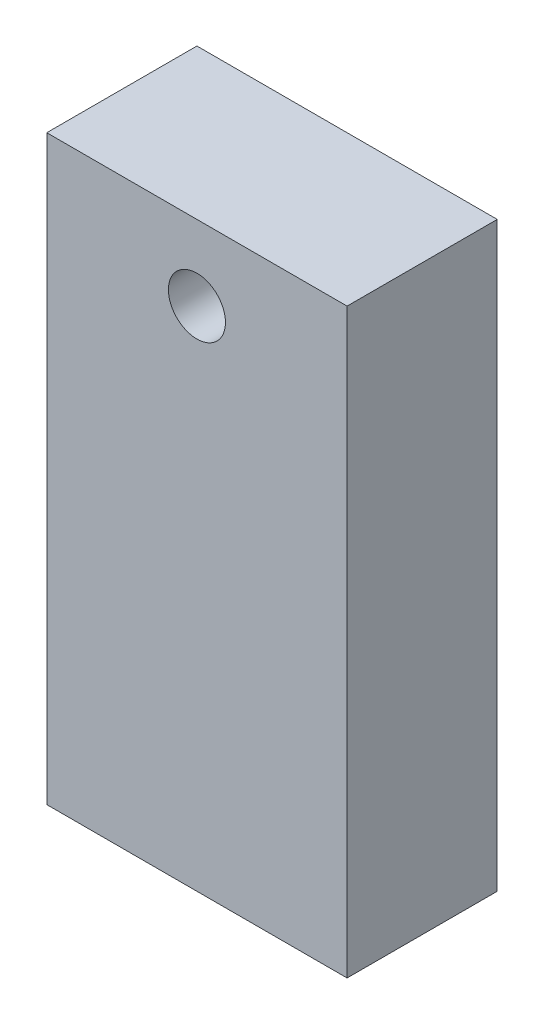
ISO-10303-21;
HEADER;
FILE_DESCRIPTION(('STEP AP214'),'2;1');
FILE_NAME('part.step','',(''),(''),'','','');
FILE_SCHEMA(('AUTOMOTIVE_DESIGN { 1 0 10303 214 1 1 1 1 }'));
ENDSEC;
DATA;
#1=APPLICATION_CONTEXT('core data for automotive mechanical design processes');
#2=APPLICATION_PROTOCOL_DEFINITION('international standard','automotive_design',2000,#1);
#3=PRODUCT_CONTEXT('',#1,'mechanical');
#4=PRODUCT('Part','Part','',(#3));
#5=PRODUCT_RELATED_PRODUCT_CATEGORY('part','',(#4));
#6=PRODUCT_DEFINITION_FORMATION('','',#4);
#7=PRODUCT_DEFINITION_CONTEXT('part definition',#1,'design');
#8=PRODUCT_DEFINITION('design','',#6,#7);
#9=PRODUCT_DEFINITION_SHAPE('','',#8);
#10=(LENGTH_UNIT() NAMED_UNIT(*) SI_UNIT(.MILLI.,.METRE.));
#11=(NAMED_UNIT(*) PLANE_ANGLE_UNIT() SI_UNIT($,.RADIAN.));
#12=(NAMED_UNIT(*) SI_UNIT($,.STERADIAN.) SOLID_ANGLE_UNIT());
#13=UNCERTAINTY_MEASURE_WITH_UNIT(LENGTH_MEASURE(1.E-05),#10,'distance_accuracy_value','');
#14=(GEOMETRIC_REPRESENTATION_CONTEXT(3) GLOBAL_UNCERTAINTY_ASSIGNED_CONTEXT((#13)) GLOBAL_UNIT_ASSIGNED_CONTEXT((#10,
#11,#12)) REPRESENTATION_CONTEXT('',''));
#15=CARTESIAN_POINT('',(0.,0.,0.));
#16=DIRECTION('',(0.,0.,1.));
#17=DIRECTION('',(1.,0.,0.));
#18=AXIS2_PLACEMENT_3D('',#15,#16,#17);
#19=CARTESIAN_POINT('',(0.,98.425,0.));
#20=DIRECTION('',(1.,0.,0.));
#21=DIRECTION('',(0.,0.,-1.));
#22=AXIS2_PLACEMENT_3D('',#19,#20,#21);
#23=PLANE('',#22);
#24=DIRECTION('',(0.,0.,1.));
#25=VECTOR('',#24,1.);
#26=CARTESIAN_POINT('',(0.,0.,0.));
#27=LINE('',#26,#25);
#28=CARTESIAN_POINT('',(0.,0.,-25.4));
#29=VERTEX_POINT('',#28);
#30=CARTESIAN_POINT('',(0.,0.,0.));
#31=VERTEX_POINT('',#30);
#32=EDGE_CURVE('E96',#29,#31,#27,.T.);
#33=ORIENTED_EDGE('',*,*,#32,.T.);
#34=DIRECTION('',(0.,-1.,0.));
#35=VECTOR('',#34,1.);
#36=CARTESIAN_POINT('',(0.,98.425,0.));
#37=LINE('',#36,#35);
#38=CARTESIAN_POINT('',(0.,98.425,0.));
#39=VERTEX_POINT('',#38);
#40=EDGE_CURVE('E11',#39,#31,#37,.T.);
#41=ORIENTED_EDGE('',*,*,#40,.F.);
#42=DIRECTION('',(0.,0.,1.));
#43=VECTOR('',#42,1.);
#44=CARTESIAN_POINT('',(0.,98.425,0.));
#45=LINE('',#44,#43);
#46=CARTESIAN_POINT('',(0.,98.425,-25.4));
#47=VERTEX_POINT('',#46);
#48=EDGE_CURVE('E84',#47,#39,#45,.T.);
#49=ORIENTED_EDGE('',*,*,#48,.F.);
#50=DIRECTION('',(0.,-1.,0.));
#51=VECTOR('',#50,1.);
#52=CARTESIAN_POINT('',(0.,98.425,-25.4));
#53=LINE('',#52,#51);
#54=EDGE_CURVE('E92',#47,#29,#53,.T.);
#55=ORIENTED_EDGE('',*,*,#54,.T.);
#56=EDGE_LOOP('',(#33,#41,#49,#55));
#57=FACE_BOUND('',#56,.T.);
#58=ADVANCED_FACE('F33',(#57),#23,.F.);
#59=CARTESIAN_POINT('',(0.,98.425,0.));
#60=DIRECTION('',(0.,0.,-1.));
#61=DIRECTION('',(-1.,0.,0.));
#62=AXIS2_PLACEMENT_3D('',#59,#60,#61);
#63=PLANE('',#62);
#64=CARTESIAN_POINT('',(25.4,85.725,0.));
#65=DIRECTION('',(0.,0.,1.));
#66=DIRECTION('',(1.,0.,0.));
#67=AXIS2_PLACEMENT_3D('',#64,#65,#66);
#68=CIRCLE('',#67,4.826);
#69=CARTESIAN_POINT('',(30.226,85.725,0.));
#70=VERTEX_POINT('',#69);
#71=EDGE_CURVE('E110',#70,#70,#68,.T.);
#72=ORIENTED_EDGE('',*,*,#71,.F.);
#73=EDGE_LOOP('',(#72));
#74=FACE_BOUND('',#73,.T.);
#75=DIRECTION('',(1.,0.,0.));
#76=VECTOR('',#75,1.);
#77=CARTESIAN_POINT('',(0.,0.,0.));
#78=LINE('',#77,#76);
#79=CARTESIAN_POINT('',(50.8,0.,0.));
#80=VERTEX_POINT('',#79);
#81=EDGE_CURVE('E88',#31,#80,#78,.T.);
#82=ORIENTED_EDGE('',*,*,#81,.T.);
#83=DIRECTION('',(0.,-1.,0.));
#84=VECTOR('',#83,1.);
#85=CARTESIAN_POINT('',(50.8,98.425,0.));
#86=LINE('',#85,#84);
#87=CARTESIAN_POINT('',(50.8,98.425,0.));
#88=VERTEX_POINT('',#87);
#89=EDGE_CURVE('E41',#88,#80,#86,.T.);
#90=ORIENTED_EDGE('',*,*,#89,.F.);
#91=DIRECTION('',(1.,0.,0.));
#92=VECTOR('',#91,1.);
#93=CARTESIAN_POINT('',(0.,98.425,0.));
#94=LINE('',#93,#92);
#95=EDGE_CURVE('E79',#39,#88,#94,.T.);
#96=ORIENTED_EDGE('',*,*,#95,.F.);
#97=ORIENTED_EDGE('',*,*,#40,.T.);
#98=EDGE_LOOP('',(#82,#90,#96,#97));
#99=FACE_BOUND('',#98,.T.);
#100=ADVANCED_FACE('F87',(#74,#99),#63,.F.);
#101=CARTESIAN_POINT('',(50.8,98.425,0.));
#102=DIRECTION('',(-1.,0.,0.));
#103=DIRECTION('',(0.,0.,1.));
#104=AXIS2_PLACEMENT_3D('',#101,#102,#103);
#105=PLANE('',#104);
#106=DIRECTION('',(0.,0.,-1.));
#107=VECTOR('',#106,1.);
#108=CARTESIAN_POINT('',(50.8,0.,0.));
#109=LINE('',#108,#107);
#110=CARTESIAN_POINT('',(50.8,0.,-25.4));
#111=VERTEX_POINT('',#110);
#112=EDGE_CURVE('E66',#80,#111,#109,.T.);
#113=ORIENTED_EDGE('',*,*,#112,.T.);
#114=DIRECTION('',(0.,-1.,0.));
#115=VECTOR('',#114,1.);
#116=CARTESIAN_POINT('',(50.8,98.425,-25.4));
#117=LINE('',#116,#115);
#118=CARTESIAN_POINT('',(50.8,98.425,-25.4));
#119=VERTEX_POINT('',#118);
#120=EDGE_CURVE('E89',#119,#111,#117,.T.);
#121=ORIENTED_EDGE('',*,*,#120,.F.);
#122=DIRECTION('',(0.,0.,-1.));
#123=VECTOR('',#122,1.);
#124=CARTESIAN_POINT('',(50.8,98.425,0.));
#125=LINE('',#124,#123);
#126=EDGE_CURVE('E82',#88,#119,#125,.T.);
#127=ORIENTED_EDGE('',*,*,#126,.F.);
#128=ORIENTED_EDGE('',*,*,#89,.T.);
#129=EDGE_LOOP('',(#113,#121,#127,#128));
#130=FACE_BOUND('',#129,.T.);
#131=ADVANCED_FACE('F90',(#130),#105,.F.);
#132=CARTESIAN_POINT('',(0.,98.425,-25.4));
#133=DIRECTION('',(0.,0.,1.));
#134=DIRECTION('',(1.,0.,0.));
#135=AXIS2_PLACEMENT_3D('',#132,#133,#134);
#136=PLANE('',#135);
#137=CARTESIAN_POINT('',(25.4,85.725,-25.4));
#138=DIRECTION('',(0.,0.,1.));
#139=DIRECTION('',(1.,0.,0.));
#140=AXIS2_PLACEMENT_3D('',#137,#138,#139);
#141=CIRCLE('',#140,4.826);
#142=CARTESIAN_POINT('',(30.226,85.725,-25.4));
#143=VERTEX_POINT('',#142);
#144=EDGE_CURVE('E99',#143,#143,#141,.T.);
#145=ORIENTED_EDGE('',*,*,#144,.T.);
#146=EDGE_LOOP('',(#145));
#147=FACE_BOUND('',#146,.T.);
#148=DIRECTION('',(-1.,0.,0.));
#149=VECTOR('',#148,1.);
#150=CARTESIAN_POINT('',(0.,0.,-25.4));
#151=LINE('',#150,#149);
#152=EDGE_CURVE('E72',#111,#29,#151,.T.);
#153=ORIENTED_EDGE('',*,*,#152,.T.);
#154=ORIENTED_EDGE('',*,*,#54,.F.);
#155=DIRECTION('',(-1.,0.,0.));
#156=VECTOR('',#155,1.);
#157=CARTESIAN_POINT('',(0.,98.425,-25.4));
#158=LINE('',#157,#156);
#159=EDGE_CURVE('E49',#119,#47,#158,.T.);
#160=ORIENTED_EDGE('',*,*,#159,.F.);
#161=ORIENTED_EDGE('',*,*,#120,.T.);
#162=EDGE_LOOP('',(#153,#154,#160,#161));
#163=FACE_BOUND('',#162,.T.);
#164=ADVANCED_FACE('F104',(#147,#163),#136,.F.);
#165=CARTESIAN_POINT('',(0.,98.425,0.));
#166=DIRECTION('',(0.,-1.,0.));
#167=DIRECTION('',(0.,0.,-1.));
#168=AXIS2_PLACEMENT_3D('',#165,#166,#167);
#169=PLANE('',#168);
#170=ORIENTED_EDGE('',*,*,#48,.T.);
#171=ORIENTED_EDGE('',*,*,#95,.T.);
#172=ORIENTED_EDGE('',*,*,#126,.T.);
#173=ORIENTED_EDGE('',*,*,#159,.T.);
#174=EDGE_LOOP('',(#170,#171,#172,#173));
#175=FACE_BOUND('',#174,.T.);
#176=ADVANCED_FACE('F80',(#175),#169,.F.);
#177=CARTESIAN_POINT('',(0.,0.,0.));
#178=DIRECTION('',(0.,-1.,0.));
#179=DIRECTION('',(0.,0.,-1.));
#180=AXIS2_PLACEMENT_3D('',#177,#178,#179);
#181=PLANE('',#180);
#182=ORIENTED_EDGE('',*,*,#32,.F.);
#183=ORIENTED_EDGE('',*,*,#152,.F.);
#184=ORIENTED_EDGE('',*,*,#112,.F.);
#185=ORIENTED_EDGE('',*,*,#81,.F.);
#186=EDGE_LOOP('',(#182,#183,#184,#185));
#187=FACE_BOUND('',#186,.T.);
#188=ADVANCED_FACE('F107',(#187),#181,.T.);
#189=CARTESIAN_POINT('',(25.4,85.725,-25.4));
#190=DIRECTION('',(0.,0.,1.));
#191=DIRECTION('',(1.,0.,0.));
#192=AXIS2_PLACEMENT_3D('',#189,#190,#191);
#193=CYLINDRICAL_SURFACE('',#192,4.826);
#194=ORIENTED_EDGE('',*,*,#144,.F.);
#195=EDGE_LOOP('',(#194));
#196=FACE_BOUND('',#195,.T.);
#197=ORIENTED_EDGE('',*,*,#71,.T.);
#198=EDGE_LOOP('',(#197));
#199=FACE_BOUND('',#198,.T.);
#200=ADVANCED_FACE('F117',(#196,#199),#193,.F.);
#201=CLOSED_SHELL('',(#58,#100,#131,#164,#176,#188,#200));
#202=MANIFOLD_SOLID_BREP('B2',#201);
#203=ADVANCED_BREP_SHAPE_REPRESENTATION('',(#18,#202),#14);
#204=SHAPE_DEFINITION_REPRESENTATION(#9,#203);
ENDSEC;
END-ISO-10303-21;
